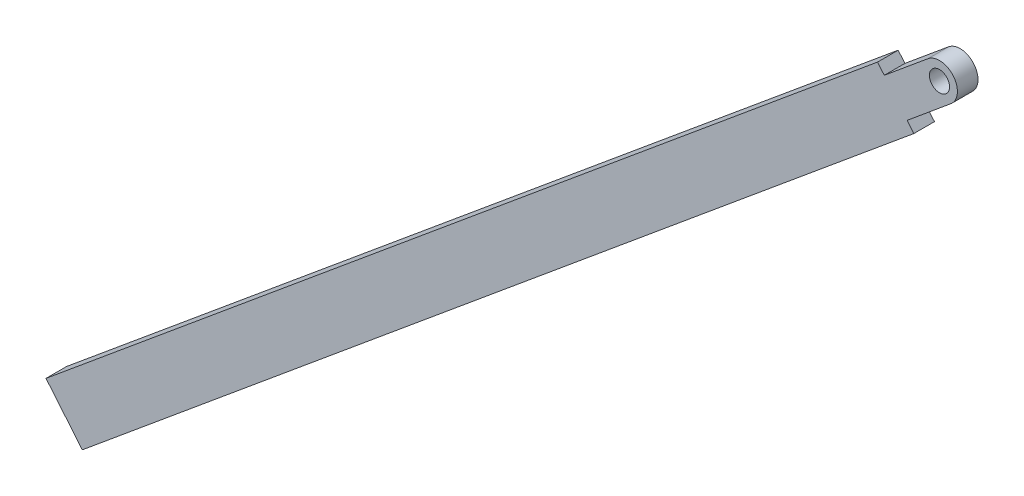
ISO-10303-21;
HEADER;
FILE_DESCRIPTION(('STEP AP214'),'2;1');
FILE_NAME('part.step','',(''),(''),'','','');
FILE_SCHEMA(('AUTOMOTIVE_DESIGN { 1 0 10303 214 1 1 1 1 }'));
ENDSEC;
DATA;
#1=APPLICATION_CONTEXT('core data for automotive mechanical design processes');
#2=APPLICATION_PROTOCOL_DEFINITION('international standard','automotive_design',2000,#1);
#3=PRODUCT_CONTEXT('',#1,'mechanical');
#4=PRODUCT('Part','Part','',(#3));
#5=PRODUCT_RELATED_PRODUCT_CATEGORY('part','',(#4));
#6=PRODUCT_DEFINITION_FORMATION('','',#4);
#7=PRODUCT_DEFINITION_CONTEXT('part definition',#1,'design');
#8=PRODUCT_DEFINITION('design','',#6,#7);
#9=PRODUCT_DEFINITION_SHAPE('','',#8);
#10=(LENGTH_UNIT() NAMED_UNIT(*) SI_UNIT(.MILLI.,.METRE.));
#11=(NAMED_UNIT(*) PLANE_ANGLE_UNIT() SI_UNIT($,.RADIAN.));
#12=(NAMED_UNIT(*) SI_UNIT($,.STERADIAN.) SOLID_ANGLE_UNIT());
#13=UNCERTAINTY_MEASURE_WITH_UNIT(LENGTH_MEASURE(1.E-05),#10,'distance_accuracy_value','');
#14=(GEOMETRIC_REPRESENTATION_CONTEXT(3) GLOBAL_UNCERTAINTY_ASSIGNED_CONTEXT((#13)) GLOBAL_UNIT_ASSIGNED_CONTEXT((#10,
#11,#12)) REPRESENTATION_CONTEXT('',''));
#15=CARTESIAN_POINT('',(0.,0.,0.));
#16=DIRECTION('',(0.,0.,1.));
#17=DIRECTION('',(1.,0.,0.));
#18=AXIS2_PLACEMENT_3D('',#15,#16,#17);
#19=CARTESIAN_POINT('',(4.,299.8,4.6));
#20=DIRECTION('',(0.,0.,-1.));
#21=DIRECTION('',(-1.,0.,0.));
#22=AXIS2_PLACEMENT_3D('',#19,#20,#21);
#23=CYLINDRICAL_SURFACE('',#22,3.99999999999998);
#24=CARTESIAN_POINT('',(4.,299.8,0.));
#25=DIRECTION('',(0.,0.,1.));
#26=DIRECTION('',(1.,0.,0.));
#27=AXIS2_PLACEMENT_3D('',#24,#25,#26);
#28=CIRCLE('',#27,3.99999999999998);
#29=CARTESIAN_POINT('',(6.55358809461555,296.721171027316,0.));
#30=VERTEX_POINT('',#29);
#31=CARTESIAN_POINT('',(1.44641190538445,302.878828972684,0.));
#32=VERTEX_POINT('',#31);
#33=EDGE_CURVE('E129',#30,#32,#28,.T.);
#34=ORIENTED_EDGE('',*,*,#33,.T.);
#35=DIRECTION('',(0.,0.,-1.));
#36=VECTOR('',#35,1.);
#37=CARTESIAN_POINT('',(1.44641190538445,302.878828972684,4.6));
#38=LINE('',#37,#36);
#39=CARTESIAN_POINT('',(1.44641190538445,302.878828972684,4.6));
#40=VERTEX_POINT('',#39);
#41=EDGE_CURVE('E11',#40,#32,#38,.T.);
#42=ORIENTED_EDGE('',*,*,#41,.F.);
#43=CARTESIAN_POINT('',(4.,299.8,4.6));
#44=DIRECTION('',(0.,0.,1.));
#45=DIRECTION('',(1.,0.,0.));
#46=AXIS2_PLACEMENT_3D('',#43,#44,#45);
#47=CIRCLE('',#46,3.99999999999998);
#48=CARTESIAN_POINT('',(6.55358809461555,296.721171027316,4.6));
#49=VERTEX_POINT('',#48);
#50=EDGE_CURVE('E144',#49,#40,#47,.T.);
#51=ORIENTED_EDGE('',*,*,#50,.F.);
#52=DIRECTION('',(0.,0.,-1.));
#53=VECTOR('',#52,1.);
#54=CARTESIAN_POINT('',(6.55358809461555,296.721171027316,4.6));
#55=LINE('',#54,#53);
#56=EDGE_CURVE('E125',#49,#30,#55,.T.);
#57=ORIENTED_EDGE('',*,*,#56,.T.);
#58=EDGE_LOOP('',(#34,#42,#51,#57));
#59=FACE_BOUND('',#58,.T.);
#60=ADVANCED_FACE('F33',(#59),#23,.T.);
#61=CARTESIAN_POINT('',(1.44641190538445,302.878828972684,4.6));
#62=DIRECTION('',(0.638397023653892,-0.769707243170969,0.));
#63=DIRECTION('',(0.769707243170969,0.638397023653892,0.));
#64=AXIS2_PLACEMENT_3D('',#61,#62,#63);
#65=PLANE('',#64);
#66=DIRECTION('',(-0.769707243170969,-0.638397023653892,0.));
#67=VECTOR('',#66,1.);
#68=CARTESIAN_POINT('',(1.44641190538445,302.878828972684,0.));
#69=LINE('',#68,#67);
#70=CARTESIAN_POINT('',(-8.32887008288687,294.771186772279,0.));
#71=VERTEX_POINT('',#70);
#72=EDGE_CURVE('E132',#32,#71,#69,.T.);
#73=ORIENTED_EDGE('',*,*,#72,.T.);
#74=DIRECTION('',(0.,0.,-1.));
#75=VECTOR('',#74,1.);
#76=CARTESIAN_POINT('',(-8.32887008288687,294.771186772279,4.6));
#77=LINE('',#76,#75);
#78=CARTESIAN_POINT('',(-8.32887008288687,294.771186772279,4.6));
#79=VERTEX_POINT('',#78);
#80=EDGE_CURVE('E41',#79,#71,#77,.T.);
#81=ORIENTED_EDGE('',*,*,#80,.F.);
#82=DIRECTION('',(-0.769707243170969,-0.638397023653892,0.));
#83=VECTOR('',#82,1.);
#84=CARTESIAN_POINT('',(1.44641190538445,302.878828972684,4.6));
#85=LINE('',#84,#83);
#86=EDGE_CURVE('E92',#40,#79,#85,.T.);
#87=ORIENTED_EDGE('',*,*,#86,.F.);
#88=ORIENTED_EDGE('',*,*,#41,.T.);
#89=EDGE_LOOP('',(#73,#81,#87,#88));
#90=FACE_BOUND('',#89,.T.);
#91=ADVANCED_FACE('F200',(#90),#65,.F.);
#92=CARTESIAN_POINT('',(-9.8291030884735,296.579998793731,4.6));
#93=DIRECTION('',(-0.769707243170973,-0.638397023653886,0.));
#94=DIRECTION('',(0.638397023653886,-0.769707243170973,0.));
#95=AXIS2_PLACEMENT_3D('',#92,#93,#94);
#96=PLANE('',#95);
#97=DIRECTION('',(-0.638397023653886,0.769707243170973,0.));
#98=VECTOR('',#97,1.);
#99=CARTESIAN_POINT('',(-9.8291030884735,296.579998793731,0.));
#100=LINE('',#99,#98);
#101=CARTESIAN_POINT('',(-9.8291030884735,296.579998793731,0.));
#102=VERTEX_POINT('',#101);
#103=EDGE_CURVE('E135',#71,#102,#100,.T.);
#104=ORIENTED_EDGE('',*,*,#103,.T.);
#105=DIRECTION('',(0.,0.,-1.));
#106=VECTOR('',#105,1.);
#107=CARTESIAN_POINT('',(-9.8291030884735,296.579998793731,4.6));
#108=LINE('',#107,#106);
#109=CARTESIAN_POINT('',(-9.8291030884735,296.579998793731,4.6));
#110=VERTEX_POINT('',#109);
#111=EDGE_CURVE('E151',#110,#102,#108,.T.);
#112=ORIENTED_EDGE('',*,*,#111,.F.);
#113=DIRECTION('',(-0.638397023653886,0.769707243170973,0.));
#114=VECTOR('',#113,1.);
#115=CARTESIAN_POINT('',(-9.8291030884735,296.579998793731,4.6));
#116=LINE('',#115,#114);
#117=EDGE_CURVE('E159',#79,#110,#116,.T.);
#118=ORIENTED_EDGE('',*,*,#117,.F.);
#119=ORIENTED_EDGE('',*,*,#80,.T.);
#120=EDGE_LOOP('',(#104,#112,#118,#119));
#121=FACE_BOUND('',#120,.T.);
#122=ADVANCED_FACE('F157',(#121),#96,.F.);
#123=CARTESIAN_POINT('',(-9.8291030884735,296.579998793731,4.6));
#124=DIRECTION('',(0.638397023653891,-0.769707243170969,0.));
#125=DIRECTION('',(0.769707243170969,0.638397023653891,0.));
#126=AXIS2_PLACEMENT_3D('',#123,#124,#125);
#127=PLANE('',#126);
#128=DIRECTION('',(-0.769707243170969,-0.638397023653891,0.));
#129=VECTOR('',#128,1.);
#130=CARTESIAN_POINT('',(-9.8291030884735,296.579998793731,0.));
#131=LINE('',#130,#129);
#132=CARTESIAN_POINT('',(-195.528615770757,142.560379981316,0.));
#133=VERTEX_POINT('',#132);
#134=EDGE_CURVE('E137',#102,#133,#131,.T.);
#135=ORIENTED_EDGE('',*,*,#134,.T.);
#136=DIRECTION('',(0.,0.,-1.));
#137=VECTOR('',#136,1.);
#138=CARTESIAN_POINT('',(-195.528615770757,142.560379981316,4.6));
#139=LINE('',#138,#137);
#140=CARTESIAN_POINT('',(-195.528615770757,142.560379981316,4.6));
#141=VERTEX_POINT('',#140);
#142=EDGE_CURVE('E148',#141,#133,#139,.T.);
#143=ORIENTED_EDGE('',*,*,#142,.F.);
#144=DIRECTION('',(-0.769707243170969,-0.638397023653891,0.));
#145=VECTOR('',#144,1.);
#146=CARTESIAN_POINT('',(-9.8291030884735,296.579998793731,4.6));
#147=LINE('',#146,#145);
#148=EDGE_CURVE('E171',#110,#141,#147,.T.);
#149=ORIENTED_EDGE('',*,*,#148,.F.);
#150=ORIENTED_EDGE('',*,*,#111,.T.);
#151=EDGE_LOOP('',(#135,#143,#149,#150));
#152=FACE_BOUND('',#151,.T.);
#153=ADVANCED_FACE('F167',(#152),#127,.F.);
#154=CARTESIAN_POINT('',(-187.420973570352,132.785097993045,4.6));
#155=DIRECTION('',(0.769707243170969,0.638397023653891,0.));
#156=DIRECTION('',(-0.638397023653891,0.769707243170969,0.));
#157=AXIS2_PLACEMENT_3D('',#154,#155,#156);
#158=PLANE('',#157);
#159=DIRECTION('',(0.638397023653891,-0.769707243170969,0.));
#160=VECTOR('',#159,1.);
#161=CARTESIAN_POINT('',(-187.420973570352,132.785097993045,0.));
#162=LINE('',#161,#160);
#163=CARTESIAN_POINT('',(-187.420973570352,132.785097993045,0.));
#164=VERTEX_POINT('',#163);
#165=EDGE_CURVE('E139',#133,#164,#162,.T.);
#166=ORIENTED_EDGE('',*,*,#165,.T.);
#167=DIRECTION('',(0.,0.,-1.));
#168=VECTOR('',#167,1.);
#169=CARTESIAN_POINT('',(-187.420973570352,132.785097993045,4.6));
#170=LINE('',#169,#168);
#171=CARTESIAN_POINT('',(-187.420973570352,132.785097993045,4.6));
#172=VERTEX_POINT('',#171);
#173=EDGE_CURVE('E120',#172,#164,#170,.T.);
#174=ORIENTED_EDGE('',*,*,#173,.F.);
#175=DIRECTION('',(0.638397023653891,-0.769707243170969,0.));
#176=VECTOR('',#175,1.);
#177=CARTESIAN_POINT('',(-187.420973570352,132.785097993045,4.6));
#178=LINE('',#177,#176);
#179=EDGE_CURVE('E111',#141,#172,#178,.T.);
#180=ORIENTED_EDGE('',*,*,#179,.F.);
#181=ORIENTED_EDGE('',*,*,#142,.T.);
#182=EDGE_LOOP('',(#166,#174,#180,#181));
#183=FACE_BOUND('',#182,.T.);
#184=ADVANCED_FACE('F170',(#183),#158,.F.);
#185=CARTESIAN_POINT('',(-1.72146088806915,286.80471680546,4.6));
#186=DIRECTION('',(-0.638397023653891,0.769707243170969,0.));
#187=DIRECTION('',(-0.769707243170969,-0.638397023653891,0.));
#188=AXIS2_PLACEMENT_3D('',#185,#186,#187);
#189=PLANE('',#188);
#190=DIRECTION('',(0.769707243170969,0.638397023653891,0.));
#191=VECTOR('',#190,1.);
#192=CARTESIAN_POINT('',(-1.72146088806915,286.80471680546,0.));
#193=LINE('',#192,#191);
#194=CARTESIAN_POINT('',(-1.72146088806915,286.80471680546,0.));
#195=VERTEX_POINT('',#194);
#196=EDGE_CURVE('E119',#164,#195,#193,.T.);
#197=ORIENTED_EDGE('',*,*,#196,.T.);
#198=DIRECTION('',(0.,0.,-1.));
#199=VECTOR('',#198,1.);
#200=CARTESIAN_POINT('',(-1.72146088806915,286.80471680546,4.6));
#201=LINE('',#200,#199);
#202=CARTESIAN_POINT('',(-1.72146088806915,286.80471680546,4.6));
#203=VERTEX_POINT('',#202);
#204=EDGE_CURVE('E116',#203,#195,#201,.T.);
#205=ORIENTED_EDGE('',*,*,#204,.F.);
#206=DIRECTION('',(0.769707243170969,0.638397023653891,0.));
#207=VECTOR('',#206,1.);
#208=CARTESIAN_POINT('',(-1.72146088806915,286.80471680546,4.6));
#209=LINE('',#208,#207);
#210=EDGE_CURVE('E105',#172,#203,#209,.T.);
#211=ORIENTED_EDGE('',*,*,#210,.F.);
#212=ORIENTED_EDGE('',*,*,#173,.T.);
#213=EDGE_LOOP('',(#197,#205,#211,#212));
#214=FACE_BOUND('',#213,.T.);
#215=ADVANCED_FACE('F117',(#214),#189,.F.);
#216=CARTESIAN_POINT('',(-3.22169389365577,288.613528826912,4.6));
#217=DIRECTION('',(-0.769707243170964,-0.638397023653897,0.));
#218=DIRECTION('',(0.638397023653897,-0.769707243170964,0.));
#219=AXIS2_PLACEMENT_3D('',#216,#217,#218);
#220=PLANE('',#219);
#221=DIRECTION('',(-0.638397023653897,0.769707243170964,0.));
#222=VECTOR('',#221,1.);
#223=CARTESIAN_POINT('',(-3.22169389365577,288.613528826912,0.));
#224=LINE('',#223,#222);
#225=CARTESIAN_POINT('',(-3.22169389365577,288.613528826912,0.));
#226=VERTEX_POINT('',#225);
#227=EDGE_CURVE('E78',#195,#226,#224,.T.);
#228=ORIENTED_EDGE('',*,*,#227,.T.);
#229=DIRECTION('',(0.,0.,-1.));
#230=VECTOR('',#229,1.);
#231=CARTESIAN_POINT('',(-3.22169389365577,288.613528826912,4.6));
#232=LINE('',#231,#230);
#233=CARTESIAN_POINT('',(-3.22169389365577,288.613528826912,4.6));
#234=VERTEX_POINT('',#233);
#235=EDGE_CURVE('E121',#234,#226,#232,.T.);
#236=ORIENTED_EDGE('',*,*,#235,.F.);
#237=DIRECTION('',(-0.638397023653897,0.769707243170964,0.));
#238=VECTOR('',#237,1.);
#239=CARTESIAN_POINT('',(-3.22169389365577,288.613528826912,4.6));
#240=LINE('',#239,#238);
#241=EDGE_CURVE('E109',#203,#234,#240,.T.);
#242=ORIENTED_EDGE('',*,*,#241,.F.);
#243=ORIENTED_EDGE('',*,*,#204,.T.);
#244=EDGE_LOOP('',(#228,#236,#242,#243));
#245=FACE_BOUND('',#244,.T.);
#246=ADVANCED_FACE('F123',(#245),#220,.F.);
#247=CARTESIAN_POINT('',(6.55358809461555,296.721171027316,4.6));
#248=DIRECTION('',(-0.638397023653892,0.769707243170969,0.));
#249=DIRECTION('',(-0.769707243170969,-0.638397023653892,0.));
#250=AXIS2_PLACEMENT_3D('',#247,#248,#249);
#251=PLANE('',#250);
#252=DIRECTION('',(0.769707243170968,0.638397023653892,0.));
#253=VECTOR('',#252,1.);
#254=CARTESIAN_POINT('',(6.55358809461555,296.721171027316,0.));
#255=LINE('',#254,#253);
#256=EDGE_CURVE('E84',#226,#30,#255,.T.);
#257=ORIENTED_EDGE('',*,*,#256,.T.);
#258=ORIENTED_EDGE('',*,*,#56,.F.);
#259=DIRECTION('',(0.769707243170968,0.638397023653892,0.));
#260=VECTOR('',#259,1.);
#261=CARTESIAN_POINT('',(6.55358809461555,296.721171027316,4.6));
#262=LINE('',#261,#260);
#263=EDGE_CURVE('E49',#234,#49,#262,.T.);
#264=ORIENTED_EDGE('',*,*,#263,.F.);
#265=ORIENTED_EDGE('',*,*,#235,.T.);
#266=EDGE_LOOP('',(#257,#258,#264,#265));
#267=FACE_BOUND('',#266,.T.);
#268=ADVANCED_FACE('F191',(#267),#251,.F.);
#269=CARTESIAN_POINT('',(4.,299.8,4.6));
#270=DIRECTION('',(0.,0.,1.));
#271=DIRECTION('',(1.,0.,0.));
#272=AXIS2_PLACEMENT_3D('',#269,#270,#271);
#273=PLANE('',#272);
#274=CARTESIAN_POINT('',(4.,299.8,4.6));
#275=DIRECTION('',(0.,0.,1.));
#276=DIRECTION('',(1.,0.,0.));
#277=AXIS2_PLACEMENT_3D('',#274,#275,#276);
#278=CIRCLE('',#277,2.25000000000002);
#279=CARTESIAN_POINT('',(6.25000000000002,299.8,4.6));
#280=VERTEX_POINT('',#279);
#281=EDGE_CURVE('E177',#280,#280,#278,.T.);
#282=ORIENTED_EDGE('',*,*,#281,.F.);
#283=EDGE_LOOP('',(#282));
#284=FACE_BOUND('',#283,.T.);
#285=ORIENTED_EDGE('',*,*,#50,.T.);
#286=ORIENTED_EDGE('',*,*,#86,.T.);
#287=ORIENTED_EDGE('',*,*,#117,.T.);
#288=ORIENTED_EDGE('',*,*,#148,.T.);
#289=ORIENTED_EDGE('',*,*,#179,.T.);
#290=ORIENTED_EDGE('',*,*,#210,.T.);
#291=ORIENTED_EDGE('',*,*,#241,.T.);
#292=ORIENTED_EDGE('',*,*,#263,.T.);
#293=EDGE_LOOP('',(#285,#286,#287,#288,#289,#290,#291,#292));
#294=FACE_BOUND('',#293,.T.);
#295=ADVANCED_FACE('F107',(#284,#294),#273,.T.);
#296=CARTESIAN_POINT('',(4.,299.8,0.));
#297=DIRECTION('',(0.,0.,1.));
#298=DIRECTION('',(1.,0.,0.));
#299=AXIS2_PLACEMENT_3D('',#296,#297,#298);
#300=PLANE('',#299);
#301=CARTESIAN_POINT('',(4.,299.8,0.));
#302=DIRECTION('',(0.,0.,1.));
#303=DIRECTION('',(1.,0.,0.));
#304=AXIS2_PLACEMENT_3D('',#301,#302,#303);
#305=CIRCLE('',#304,2.25000000000002);
#306=CARTESIAN_POINT('',(6.25000000000002,299.8,0.));
#307=VERTEX_POINT('',#306);
#308=EDGE_CURVE('E133',#307,#307,#305,.T.);
#309=ORIENTED_EDGE('',*,*,#308,.T.);
#310=EDGE_LOOP('',(#309));
#311=FACE_BOUND('',#310,.T.);
#312=ORIENTED_EDGE('',*,*,#33,.F.);
#313=ORIENTED_EDGE('',*,*,#256,.F.);
#314=ORIENTED_EDGE('',*,*,#227,.F.);
#315=ORIENTED_EDGE('',*,*,#196,.F.);
#316=ORIENTED_EDGE('',*,*,#165,.F.);
#317=ORIENTED_EDGE('',*,*,#134,.F.);
#318=ORIENTED_EDGE('',*,*,#103,.F.);
#319=ORIENTED_EDGE('',*,*,#72,.F.);
#320=EDGE_LOOP('',(#312,#313,#314,#315,#316,#317,#318,#319));
#321=FACE_BOUND('',#320,.T.);
#322=ADVANCED_FACE('F163',(#311,#321),#300,.F.);
#323=CARTESIAN_POINT('',(4.,299.8,0.));
#324=DIRECTION('',(0.,0.,1.));
#325=DIRECTION('',(1.,0.,0.));
#326=AXIS2_PLACEMENT_3D('',#323,#324,#325);
#327=CYLINDRICAL_SURFACE('',#326,2.25000000000002);
#328=ORIENTED_EDGE('',*,*,#308,.F.);
#329=EDGE_LOOP('',(#328));
#330=FACE_BOUND('',#329,.T.);
#331=ORIENTED_EDGE('',*,*,#281,.T.);
#332=EDGE_LOOP('',(#331));
#333=FACE_BOUND('',#332,.T.);
#334=ADVANCED_FACE('F184',(#330,#333),#327,.F.);
#335=CLOSED_SHELL('',(#60,#91,#122,#153,#184,#215,#246,#268,#295,#322,#334));
#336=MANIFOLD_SOLID_BREP('B2',#335);
#337=ADVANCED_BREP_SHAPE_REPRESENTATION('',(#18,#336),#14);
#338=SHAPE_DEFINITION_REPRESENTATION(#9,#337);
ENDSEC;
END-ISO-10303-21;
